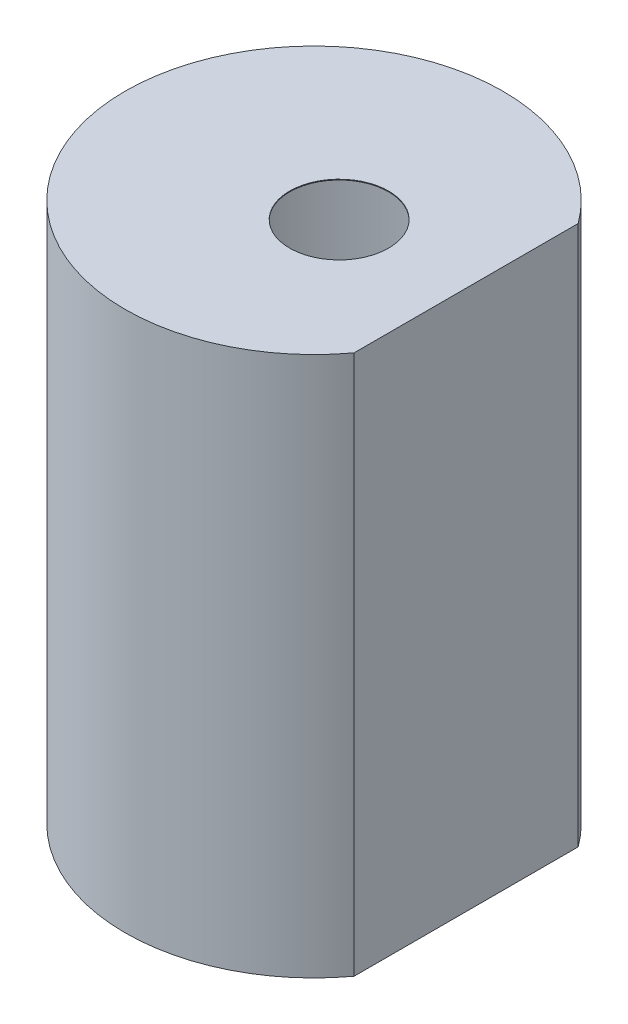
ISO-10303-21;
HEADER;
FILE_DESCRIPTION(('STEP AP214'),'2;1');
FILE_NAME('part.step','',(''),(''),'','','');
FILE_SCHEMA(('AUTOMOTIVE_DESIGN { 1 0 10303 214 1 1 1 1 }'));
ENDSEC;
DATA;
#1=APPLICATION_CONTEXT('core data for automotive mechanical design processes');
#2=APPLICATION_PROTOCOL_DEFINITION('international standard','automotive_design',2000,#1);
#3=PRODUCT_CONTEXT('',#1,'mechanical');
#4=PRODUCT('Part','Part','',(#3));
#5=PRODUCT_RELATED_PRODUCT_CATEGORY('part','',(#4));
#6=PRODUCT_DEFINITION_FORMATION('','',#4);
#7=PRODUCT_DEFINITION_CONTEXT('part definition',#1,'design');
#8=PRODUCT_DEFINITION('design','',#6,#7);
#9=PRODUCT_DEFINITION_SHAPE('','',#8);
#10=(LENGTH_UNIT() NAMED_UNIT(*) SI_UNIT(.MILLI.,.METRE.));
#11=(NAMED_UNIT(*) PLANE_ANGLE_UNIT() SI_UNIT($,.RADIAN.));
#12=(NAMED_UNIT(*) SI_UNIT($,.STERADIAN.) SOLID_ANGLE_UNIT());
#13=UNCERTAINTY_MEASURE_WITH_UNIT(LENGTH_MEASURE(1.E-05),#10,'distance_accuracy_value','');
#14=(GEOMETRIC_REPRESENTATION_CONTEXT(3) GLOBAL_UNCERTAINTY_ASSIGNED_CONTEXT((#13)) GLOBAL_UNIT_ASSIGNED_CONTEXT((#10,
#11,#12)) REPRESENTATION_CONTEXT('',''));
#15=CARTESIAN_POINT('',(0.,0.,0.));
#16=DIRECTION('',(0.,0.,1.));
#17=DIRECTION('',(1.,0.,0.));
#18=AXIS2_PLACEMENT_3D('',#15,#16,#17);
#19=CARTESIAN_POINT('',(12.7,762.,-3.03263637729029));
#20=DIRECTION('',(-1.,0.,0.));
#21=DIRECTION('',(0.,0.,1.));
#22=AXIS2_PLACEMENT_3D('',#19,#20,#21);
#23=PLANE('',#22);
#24=DIRECTION('',(0.,0.,-1.));
#25=VECTOR('',#24,1.);
#26=CARTESIAN_POINT('',(12.7,0.,-3.03263637729029));
#27=LINE('',#26,#25);
#28=CARTESIAN_POINT('',(12.7,0.,309.028124230939));
#29=VERTEX_POINT('',#28);
#30=CARTESIAN_POINT('',(12.7,0.,-7.26076060822938));
#31=VERTEX_POINT('',#30);
#32=EDGE_CURVE('E62',#29,#31,#27,.T.);
#33=ORIENTED_EDGE('',*,*,#32,.T.);
#34=DIRECTION('',(0.,-1.,0.));
#35=VECTOR('',#34,1.);
#36=CARTESIAN_POINT('',(12.7,762.,-7.26076060822938));
#37=LINE('',#36,#35);
#38=CARTESIAN_POINT('',(12.7,762.,-7.26076060822938));
#39=VERTEX_POINT('',#38);
#40=EDGE_CURVE('E44',#39,#31,#37,.T.);
#41=ORIENTED_EDGE('',*,*,#40,.F.);
#42=DIRECTION('',(0.,0.,-1.));
#43=VECTOR('',#42,1.);
#44=CARTESIAN_POINT('',(12.7,762.,-3.03263637729029));
#45=LINE('',#44,#43);
#46=CARTESIAN_POINT('',(12.7,762.,309.028124230939));
#47=VERTEX_POINT('',#46);
#48=EDGE_CURVE('E52',#47,#39,#45,.T.);
#49=ORIENTED_EDGE('',*,*,#48,.F.);
#50=DIRECTION('',(0.,-1.,0.));
#51=VECTOR('',#50,1.);
#52=CARTESIAN_POINT('',(12.7,762.,309.028124230939));
#53=LINE('',#52,#51);
#54=EDGE_CURVE('E11',#47,#29,#53,.T.);
#55=ORIENTED_EDGE('',*,*,#54,.T.);
#56=EDGE_LOOP('',(#33,#41,#49,#55));
#57=FACE_BOUND('',#56,.T.);
#58=ADVANCED_FACE('F34',(#57),#23,.F.);
#59=CARTESIAN_POINT('',(0.,761.,-3.03263637729029));
#60=DIRECTION('',(-1.,0.,0.));
#61=DIRECTION('',(0.,0.,1.));
#62=AXIS2_PLACEMENT_3D('',#59,#60,#61);
#63=PLANE('',#62);
#64=DIRECTION('',(0.,0.,-1.));
#65=VECTOR('',#64,1.);
#66=CARTESIAN_POINT('',(0.,1.,-3.03263637729029));
#67=LINE('',#66,#65);
#68=CARTESIAN_POINT('',(0.,1.,304.8));
#69=VERTEX_POINT('',#68);
#70=CARTESIAN_POINT('',(0.,1.,-3.03263637729029));
#71=VERTEX_POINT('',#70);
#72=EDGE_CURVE('E80',#69,#71,#67,.T.);
#73=ORIENTED_EDGE('',*,*,#72,.F.);
#74=DIRECTION('',(0.,-1.,0.));
#75=VECTOR('',#74,1.);
#76=CARTESIAN_POINT('',(0.,761.,304.8));
#77=LINE('',#76,#75);
#78=CARTESIAN_POINT('',(0.,761.,304.8));
#79=VERTEX_POINT('',#78);
#80=EDGE_CURVE('E92',#79,#69,#77,.T.);
#81=ORIENTED_EDGE('',*,*,#80,.F.);
#82=DIRECTION('',(0.,0.,-1.));
#83=VECTOR('',#82,1.);
#84=CARTESIAN_POINT('',(0.,761.,-3.03263637729029));
#85=LINE('',#84,#83);
#86=CARTESIAN_POINT('',(0.,761.,-3.03263637729029));
#87=VERTEX_POINT('',#86);
#88=EDGE_CURVE('E70',#79,#87,#85,.T.);
#89=ORIENTED_EDGE('',*,*,#88,.T.);
#90=DIRECTION('',(0.,-1.,0.));
#91=VECTOR('',#90,1.);
#92=CARTESIAN_POINT('',(0.,761.,-3.03263637729029));
#93=LINE('',#92,#91);
#94=EDGE_CURVE('E87',#87,#71,#93,.T.);
#95=ORIENTED_EDGE('',*,*,#94,.T.);
#96=EDGE_LOOP('',(#73,#81,#89,#95));
#97=FACE_BOUND('',#96,.T.);
#98=ADVANCED_FACE('F88',(#97),#63,.T.);
#99=CARTESIAN_POINT('',(-202.053871517602,761.,150.883681811355));
#100=DIRECTION('',(0.,-1.,0.));
#101=DIRECTION('',(0.,0.,-1.));
#102=AXIS2_PLACEMENT_3D('',#99,#100,#101);
#103=CYLINDRICAL_SURFACE('',#102,254.);
#104=CARTESIAN_POINT('',(-202.053871517602,1.,150.883681811355));
#105=DIRECTION('',(0.,1.,0.));
#106=DIRECTION('',(0.,0.,1.));
#107=AXIS2_PLACEMENT_3D('',#104,#105,#106);
#108=CIRCLE('',#107,254.);
#109=EDGE_CURVE('E83',#71,#69,#108,.T.);
#110=ORIENTED_EDGE('',*,*,#109,.F.);
#111=ORIENTED_EDGE('',*,*,#94,.F.);
#112=CARTESIAN_POINT('',(-202.053871517602,761.,150.883681811355));
#113=DIRECTION('',(0.,1.,0.));
#114=DIRECTION('',(0.,0.,1.));
#115=AXIS2_PLACEMENT_3D('',#112,#113,#114);
#116=CIRCLE('',#115,254.);
#117=EDGE_CURVE('E85',#87,#79,#116,.T.);
#118=ORIENTED_EDGE('',*,*,#117,.T.);
#119=ORIENTED_EDGE('',*,*,#80,.T.);
#120=EDGE_LOOP('',(#110,#111,#118,#119));
#121=FACE_BOUND('',#120,.T.);
#122=ADVANCED_FACE('F94',(#121),#103,.F.);
#123=CARTESIAN_POINT('',(-202.053871517602,1.,150.883681811355));
#124=DIRECTION('',(0.,1.,0.));
#125=DIRECTION('',(0.,0.,1.));
#126=AXIS2_PLACEMENT_3D('',#123,#124,#125);
#127=PLANE('',#126);
#128=CARTESIAN_POINT('',(-202.053871517601,1.,150.883681811355));
#129=DIRECTION('',(0.,1.,0.));
#130=DIRECTION('',(0.,0.,1.));
#131=AXIS2_PLACEMENT_3D('',#128,#129,#130);
#132=CIRCLE('',#131,50.8);
#133=CARTESIAN_POINT('',(-202.053871517601,1.,201.683681811355));
#134=VERTEX_POINT('',#133);
#135=EDGE_CURVE('E98',#134,#134,#132,.F.);
#136=ORIENTED_EDGE('',*,*,#135,.T.);
#137=EDGE_LOOP('',(#136));
#138=FACE_BOUND('',#137,.T.);
#139=ORIENTED_EDGE('',*,*,#109,.T.);
#140=ORIENTED_EDGE('',*,*,#72,.T.);
#141=EDGE_LOOP('',(#139,#140));
#142=FACE_BOUND('',#141,.T.);
#143=ADVANCED_FACE('F81',(#138,#142),#127,.T.);
#144=CARTESIAN_POINT('',(-202.053871517602,761.,150.883681811355));
#145=DIRECTION('',(0.,1.,0.));
#146=DIRECTION('',(0.,0.,1.));
#147=AXIS2_PLACEMENT_3D('',#144,#145,#146);
#148=PLANE('',#147);
#149=CARTESIAN_POINT('',(-160.748365747144,761.,156.734678941043));
#150=DIRECTION('',(0.,1.,0.));
#151=DIRECTION('',(0.,0.,1.));
#152=AXIS2_PLACEMENT_3D('',#149,#150,#151);
#153=CIRCLE('',#152,69.85);
#154=CARTESIAN_POINT('',(-230.598365747144,761.,156.734678941043));
#155=VERTEX_POINT('',#154);
#156=EDGE_CURVE('E113',#155,#155,#153,.F.);
#157=ORIENTED_EDGE('',*,*,#156,.F.);
#158=EDGE_LOOP('',(#157));
#159=FACE_BOUND('',#158,.T.);
#160=ORIENTED_EDGE('',*,*,#117,.F.);
#161=ORIENTED_EDGE('',*,*,#88,.F.);
#162=EDGE_LOOP('',(#160,#161));
#163=FACE_BOUND('',#162,.T.);
#164=ADVANCED_FACE('F122',(#159,#163),#148,.F.);
#165=CARTESIAN_POINT('',(-202.053871517601,152.,150.883681811355));
#166=DIRECTION('',(0.,-1.,0.));
#167=DIRECTION('',(0.,0.,-1.));
#168=AXIS2_PLACEMENT_3D('',#165,#166,#167);
#169=CYLINDRICAL_SURFACE('',#168,50.8);
#170=ORIENTED_EDGE('',*,*,#135,.F.);
#171=EDGE_LOOP('',(#170));
#172=FACE_BOUND('',#171,.T.);
#173=CARTESIAN_POINT('',(-202.053871517601,0.,150.883681811355));
#174=DIRECTION('',(0.,1.,0.));
#175=DIRECTION('',(0.,0.,1.));
#176=AXIS2_PLACEMENT_3D('',#173,#174,#175);
#177=CIRCLE('',#176,50.8);
#178=CARTESIAN_POINT('',(-202.053871517601,0.,201.683681811355));
#179=VERTEX_POINT('',#178);
#180=EDGE_CURVE('E95',#179,#179,#177,.F.);
#181=ORIENTED_EDGE('',*,*,#180,.T.);
#182=EDGE_LOOP('',(#181));
#183=FACE_BOUND('',#182,.T.);
#184=ADVANCED_FACE('F124',(#172,#183),#169,.F.);
#185=CARTESIAN_POINT('',(-160.748365747143,386.119433499163,156.734678941045));
#186=DIRECTION('',(0.,1.,0.));
#187=DIRECTION('',(-1.,0.,0.));
#188=AXIS2_PLACEMENT_3D('',#185,#186,#187);
#189=CYLINDRICAL_SURFACE('',#188,69.85);
#190=CARTESIAN_POINT('',(-160.748365747144,762.,156.734678941043));
#191=DIRECTION('',(0.,1.,0.));
#192=DIRECTION('',(0.,0.,1.));
#193=AXIS2_PLACEMENT_3D('',#190,#191,#192);
#194=CIRCLE('',#193,69.85);
#195=CARTESIAN_POINT('',(-230.598365747144,762.,156.734678941043));
#196=VERTEX_POINT('',#195);
#197=EDGE_CURVE('E38',#196,#196,#194,.F.);
#198=CARTESIAN_POINT('',(-230.598365747144,762.,156.734678941043));
#199=CARTESIAN_POINT('',(-230.598365747144,761.989583333333,156.734678941043));
#200=CARTESIAN_POINT('',(-230.598365747144,761.979166666667,156.734678941043));
#201=CARTESIAN_POINT('',(-230.598365747144,761.958333333333,156.734678941043));
#202=CARTESIAN_POINT('',(-230.598365747144,761.947916666667,156.734678941043));
#203=CARTESIAN_POINT('',(-230.598365747144,761.927083333333,156.734678941043));
#204=CARTESIAN_POINT('',(-230.598365747144,761.916666666667,156.734678941043));
#205=CARTESIAN_POINT('',(-230.598365747144,761.895833333333,156.734678941043));
#206=CARTESIAN_POINT('',(-230.598365747144,761.885416666667,156.734678941043));
#207=CARTESIAN_POINT('',(-230.598365747144,761.864583333333,156.734678941043));
#208=CARTESIAN_POINT('',(-230.598365747144,761.854166666667,156.734678941043));
#209=CARTESIAN_POINT('',(-230.598365747144,761.833333333333,156.734678941043));
#210=CARTESIAN_POINT('',(-230.598365747144,761.822916666667,156.734678941043));
#211=CARTESIAN_POINT('',(-230.598365747144,761.802083333333,156.734678941043));
#212=CARTESIAN_POINT('',(-230.598365747144,761.791666666667,156.734678941043));
#213=CARTESIAN_POINT('',(-230.598365747144,761.770833333333,156.734678941043));
#214=CARTESIAN_POINT('',(-230.598365747144,761.760416666667,156.734678941043));
#215=CARTESIAN_POINT('',(-230.598365747144,761.739583333333,156.734678941043));
#216=CARTESIAN_POINT('',(-230.598365747144,761.729166666667,156.734678941043));
#217=CARTESIAN_POINT('',(-230.598365747144,761.708333333333,156.734678941043));
#218=CARTESIAN_POINT('',(-230.598365747144,761.697916666667,156.734678941043));
#219=CARTESIAN_POINT('',(-230.598365747144,761.677083333333,156.734678941043));
#220=CARTESIAN_POINT('',(-230.598365747144,761.666666666667,156.734678941043));
#221=CARTESIAN_POINT('',(-230.598365747144,761.645833333333,156.734678941043));
#222=CARTESIAN_POINT('',(-230.598365747144,761.635416666667,156.734678941043));
#223=CARTESIAN_POINT('',(-230.598365747144,761.614583333333,156.734678941043));
#224=CARTESIAN_POINT('',(-230.598365747144,761.604166666667,156.734678941043));
#225=CARTESIAN_POINT('',(-230.598365747144,761.583333333333,156.734678941043));
#226=CARTESIAN_POINT('',(-230.598365747144,761.572916666667,156.734678941043));
#227=CARTESIAN_POINT('',(-230.598365747144,761.552083333333,156.734678941043));
#228=CARTESIAN_POINT('',(-230.598365747144,761.541666666667,156.734678941043));
#229=CARTESIAN_POINT('',(-230.598365747144,761.520833333333,156.734678941043));
#230=CARTESIAN_POINT('',(-230.598365747144,761.510416666667,156.734678941043));
#231=CARTESIAN_POINT('',(-230.598365747144,761.489583333333,156.734678941043));
#232=CARTESIAN_POINT('',(-230.598365747144,761.479166666667,156.734678941043));
#233=CARTESIAN_POINT('',(-230.598365747144,761.458333333333,156.734678941043));
#234=CARTESIAN_POINT('',(-230.598365747144,761.447916666667,156.734678941043));
#235=CARTESIAN_POINT('',(-230.598365747144,761.427083333333,156.734678941043));
#236=CARTESIAN_POINT('',(-230.598365747144,761.416666666667,156.734678941043));
#237=CARTESIAN_POINT('',(-230.598365747144,761.395833333333,156.734678941043));
#238=CARTESIAN_POINT('',(-230.598365747144,761.385416666667,156.734678941043));
#239=CARTESIAN_POINT('',(-230.598365747144,761.364583333333,156.734678941043));
#240=CARTESIAN_POINT('',(-230.598365747144,761.354166666667,156.734678941043));
#241=CARTESIAN_POINT('',(-230.598365747144,761.333333333333,156.734678941043));
#242=CARTESIAN_POINT('',(-230.598365747144,761.322916666667,156.734678941043));
#243=CARTESIAN_POINT('',(-230.598365747144,761.302083333333,156.734678941043));
#244=CARTESIAN_POINT('',(-230.598365747144,761.291666666667,156.734678941043));
#245=CARTESIAN_POINT('',(-230.598365747144,761.270833333333,156.734678941043));
#246=CARTESIAN_POINT('',(-230.598365747144,761.260416666667,156.734678941043));
#247=CARTESIAN_POINT('',(-230.598365747144,761.239583333333,156.734678941043));
#248=CARTESIAN_POINT('',(-230.598365747144,761.229166666667,156.734678941043));
#249=CARTESIAN_POINT('',(-230.598365747144,761.208333333333,156.734678941043));
#250=CARTESIAN_POINT('',(-230.598365747144,761.197916666667,156.734678941043));
#251=CARTESIAN_POINT('',(-230.598365747144,761.177083333333,156.734678941043));
#252=CARTESIAN_POINT('',(-230.598365747144,761.166666666667,156.734678941043));
#253=CARTESIAN_POINT('',(-230.598365747144,761.145833333333,156.734678941043));
#254=CARTESIAN_POINT('',(-230.598365747144,761.135416666667,156.734678941043));
#255=CARTESIAN_POINT('',(-230.598365747144,761.114583333333,156.734678941043));
#256=CARTESIAN_POINT('',(-230.598365747144,761.104166666667,156.734678941043));
#257=CARTESIAN_POINT('',(-230.598365747144,761.083333333333,156.734678941043));
#258=CARTESIAN_POINT('',(-230.598365747144,761.072916666667,156.734678941043));
#259=CARTESIAN_POINT('',(-230.598365747144,761.052083333333,156.734678941043));
#260=CARTESIAN_POINT('',(-230.598365747144,761.041666666667,156.734678941043));
#261=CARTESIAN_POINT('',(-230.598365747144,761.020833333333,156.734678941043));
#262=CARTESIAN_POINT('',(-230.598365747144,761.010416666667,156.734678941043));
#263=CARTESIAN_POINT('',(-230.598365747144,761.,156.734678941043));
#264=B_SPLINE_CURVE_WITH_KNOTS('',3,(#198,#199,#200,#201,#202,#203,#204,#205,#206,#207,#208,
#209,#210,#211,#212,#213,#214,#215,#216,#217,#218,#219,#220,#221,#222,#223,#224,#225,#226,#227,
#228,#229,#230,#231,#232,#233,#234,#235,#236,#237,#238,#239,#240,#241,#242,#243,#244,#245,#246,
#247,#248,#249,#250,#251,#252,#253,#254,#255,#256,#257,#258,#259,#260,#261,#262,#263),
.UNSPECIFIED.,.F.,.F.,(4,2,2,2,2,2,2,2,2,2,2,2,2,2,2,2,2,2,2,2,2,2,2,2,2,2,2,2,2,2,2,2,4),(0.,
0.0312500000000382,0.0625000000000764,0.0937500000000036,0.125000000000042,0.15625000000008,
0.187500000000007,0.218750000000045,0.250000000000083,0.281250000000011,0.312500000000049,
0.343750000000087,0.375000000000014,0.406250000000052,0.437500000000091,0.468750000000018,
0.500000000000056,0.531250000000094,0.562500000000021,0.59375000000006,0.625000000000098,
0.656250000000025,0.687500000000063,0.718750000000101,0.750000000000028,0.781250000000067,
0.812500000000105,0.843750000000032,0.87500000000007,0.906250000000108,0.937500000000036,
0.968750000000074,1.00000000000011),.UNSPECIFIED.);
#265=EDGE_CURVE('BSEAM132',#196,#155,#264,.T.);
#266=ORIENTED_EDGE('',*,*,#197,.F.);
#267=ORIENTED_EDGE('',*,*,#156,.T.);
#268=ORIENTED_EDGE('',*,*,#265,.T.);
#269=ORIENTED_EDGE('',*,*,#265,.F.);
#270=EDGE_LOOP('',(#266,#268,#267,#269));
#271=FACE_BOUND('',#270,.T.);
#272=ADVANCED_FACE('F132',(#271),#189,.F.);
#273=CARTESIAN_POINT('',(-202.053871517602,762.,150.883681811355));
#274=DIRECTION('',(0.,1.,0.));
#275=DIRECTION('',(0.,0.,1.));
#276=AXIS2_PLACEMENT_3D('',#273,#274,#275);
#277=PLANE('',#276);
#278=ORIENTED_EDGE('',*,*,#197,.T.);
#279=EDGE_LOOP('',(#278));
#280=FACE_BOUND('',#279,.T.);
#281=CARTESIAN_POINT('',(-202.053871517602,762.,150.883681811355));
#282=DIRECTION('',(0.,1.,0.));
#283=DIRECTION('',(1.,0.,0.));
#284=AXIS2_PLACEMENT_3D('',#281,#282,#283);
#285=CIRCLE('',#284,266.7);
#286=EDGE_CURVE('E105',#39,#47,#285,.T.);
#287=ORIENTED_EDGE('',*,*,#286,.T.);
#288=ORIENTED_EDGE('',*,*,#48,.T.);
#289=EDGE_LOOP('',(#287,#288));
#290=FACE_BOUND('',#289,.T.);
#291=ADVANCED_FACE('F147',(#280,#290),#277,.T.);
#292=CARTESIAN_POINT('',(-202.053871517602,0.,150.883681811355));
#293=DIRECTION('',(0.,1.,0.));
#294=DIRECTION('',(0.,0.,1.));
#295=AXIS2_PLACEMENT_3D('',#292,#293,#294);
#296=PLANE('',#295);
#297=ORIENTED_EDGE('',*,*,#180,.F.);
#298=EDGE_LOOP('',(#297));
#299=FACE_BOUND('',#298,.T.);
#300=CARTESIAN_POINT('',(-202.053871517602,0.,150.883681811355));
#301=DIRECTION('',(0.,1.,0.));
#302=DIRECTION('',(1.,0.,0.));
#303=AXIS2_PLACEMENT_3D('',#300,#301,#302);
#304=CIRCLE('',#303,266.7);
#305=EDGE_CURVE('E104',#31,#29,#304,.T.);
#306=ORIENTED_EDGE('',*,*,#305,.F.);
#307=ORIENTED_EDGE('',*,*,#32,.F.);
#308=EDGE_LOOP('',(#306,#307));
#309=FACE_BOUND('',#308,.T.);
#310=ADVANCED_FACE('F150',(#299,#309),#296,.F.);
#311=CARTESIAN_POINT('',(-202.053871517602,762.,150.883681811355));
#312=DIRECTION('',(0.,-1.,0.));
#313=DIRECTION('',(0.,0.,-1.));
#314=AXIS2_PLACEMENT_3D('',#311,#312,#313);
#315=CYLINDRICAL_SURFACE('',#314,266.7);
#316=ORIENTED_EDGE('',*,*,#305,.T.);
#317=ORIENTED_EDGE('',*,*,#54,.F.);
#318=ORIENTED_EDGE('',*,*,#286,.F.);
#319=ORIENTED_EDGE('',*,*,#40,.T.);
#320=EDGE_LOOP('',(#316,#317,#318,#319));
#321=FACE_BOUND('',#320,.T.);
#322=ADVANCED_FACE('F36',(#321),#315,.T.);
#323=CLOSED_SHELL('',(#58,#98,#122,#143,#164,#184,#272,#291,#310,#322));
#324=MANIFOLD_SOLID_BREP('B2',#323);
#325=ADVANCED_BREP_SHAPE_REPRESENTATION('',(#18,#324),#14);
#326=SHAPE_DEFINITION_REPRESENTATION(#9,#325);
ENDSEC;
END-ISO-10303-21;
